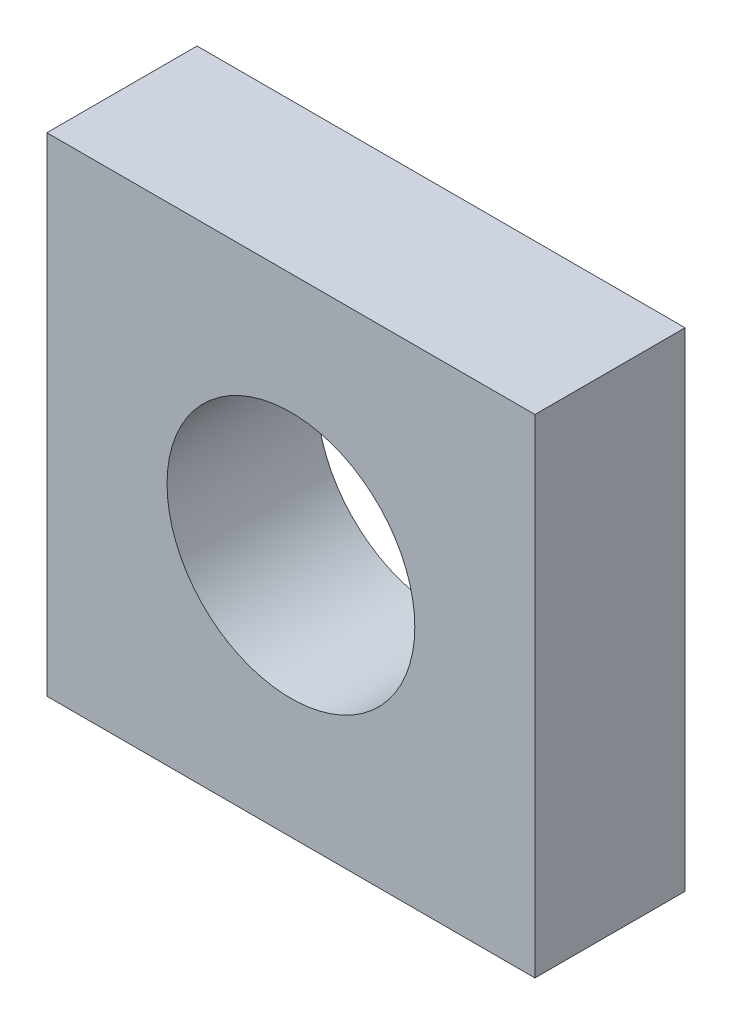
ISO-10303-21;
HEADER;
FILE_DESCRIPTION(('STEP AP214'),'2;1');
FILE_NAME('part.step','',(''),(''),'','','');
FILE_SCHEMA(('AUTOMOTIVE_DESIGN { 1 0 10303 214 1 1 1 1 }'));
ENDSEC;
DATA;
#1=APPLICATION_CONTEXT('core data for automotive mechanical design processes');
#2=APPLICATION_PROTOCOL_DEFINITION('international standard','automotive_design',2000,#1);
#3=PRODUCT_CONTEXT('',#1,'mechanical');
#4=PRODUCT('Part','Part','',(#3));
#5=PRODUCT_RELATED_PRODUCT_CATEGORY('part','',(#4));
#6=PRODUCT_DEFINITION_FORMATION('','',#4);
#7=PRODUCT_DEFINITION_CONTEXT('part definition',#1,'design');
#8=PRODUCT_DEFINITION('design','',#6,#7);
#9=PRODUCT_DEFINITION_SHAPE('','',#8);
#10=(LENGTH_UNIT() NAMED_UNIT(*) SI_UNIT(.MILLI.,.METRE.));
#11=(NAMED_UNIT(*) PLANE_ANGLE_UNIT() SI_UNIT($,.RADIAN.));
#12=(NAMED_UNIT(*) SI_UNIT($,.STERADIAN.) SOLID_ANGLE_UNIT());
#13=UNCERTAINTY_MEASURE_WITH_UNIT(LENGTH_MEASURE(1.E-05),#10,'distance_accuracy_value','');
#14=(GEOMETRIC_REPRESENTATION_CONTEXT(3) GLOBAL_UNCERTAINTY_ASSIGNED_CONTEXT((#13)) GLOBAL_UNIT_ASSIGNED_CONTEXT((#10,
#11,#12)) REPRESENTATION_CONTEXT('',''));
#15=CARTESIAN_POINT('',(0.,0.,0.));
#16=DIRECTION('',(0.,0.,1.));
#17=DIRECTION('',(1.,0.,0.));
#18=AXIS2_PLACEMENT_3D('',#15,#16,#17);
#19=CARTESIAN_POINT('',(0.,6.5,2.));
#20=DIRECTION('',(1.,0.,0.));
#21=DIRECTION('',(0.,1.,0.));
#22=AXIS2_PLACEMENT_3D('',#19,#20,#21);
#23=PLANE('',#22);
#24=DIRECTION('',(0.,-1.,0.));
#25=VECTOR('',#24,1.);
#26=CARTESIAN_POINT('',(0.,3.25,0.));
#27=LINE('',#26,#25);
#28=CARTESIAN_POINT('',(0.,6.5,0.));
#29=VERTEX_POINT('',#28);
#30=CARTESIAN_POINT('',(0.,0.,0.));
#31=VERTEX_POINT('',#30);
#32=EDGE_CURVE('E11',#29,#31,#27,.T.);
#33=ORIENTED_EDGE('',*,*,#32,.T.);
#34=DIRECTION('',(0.,0.,-1.));
#35=VECTOR('',#34,1.);
#36=CARTESIAN_POINT('',(0.,0.,1.));
#37=LINE('',#36,#35);
#38=CARTESIAN_POINT('',(0.,0.,2.));
#39=VERTEX_POINT('',#38);
#40=EDGE_CURVE('E57',#39,#31,#37,.T.);
#41=ORIENTED_EDGE('',*,*,#40,.F.);
#42=DIRECTION('',(0.,-1.,0.));
#43=VECTOR('',#42,1.);
#44=CARTESIAN_POINT('',(0.,3.25,2.));
#45=LINE('',#44,#43);
#46=CARTESIAN_POINT('',(0.,6.5,2.));
#47=VERTEX_POINT('',#46);
#48=EDGE_CURVE('E75',#47,#39,#45,.T.);
#49=ORIENTED_EDGE('',*,*,#48,.F.);
#50=DIRECTION('',(0.,0.,-1.));
#51=VECTOR('',#50,1.);
#52=CARTESIAN_POINT('',(0.,6.5,1.));
#53=LINE('',#52,#51);
#54=EDGE_CURVE('E43',#47,#29,#53,.T.);
#55=ORIENTED_EDGE('',*,*,#54,.T.);
#56=EDGE_LOOP('',(#33,#41,#49,#55));
#57=FACE_BOUND('',#56,.T.);
#58=ADVANCED_FACE('F40',(#57),#23,.F.);
#59=CARTESIAN_POINT('',(0.,0.,0.));
#60=DIRECTION('',(0.,0.,1.));
#61=DIRECTION('',(1.,0.,0.));
#62=AXIS2_PLACEMENT_3D('',#59,#60,#61);
#63=PLANE('',#62);
#64=CARTESIAN_POINT('',(3.25,3.25,0.));
#65=DIRECTION('',(0.,0.,1.));
#66=DIRECTION('',(1.,0.,0.));
#67=AXIS2_PLACEMENT_3D('',#64,#65,#66);
#68=CIRCLE('',#67,1.65);
#69=CARTESIAN_POINT('',(4.9,3.25,0.));
#70=VERTEX_POINT('',#69);
#71=EDGE_CURVE('E111',#70,#70,#68,.T.);
#72=ORIENTED_EDGE('',*,*,#71,.T.);
#73=EDGE_LOOP('',(#72));
#74=FACE_BOUND('',#73,.T.);
#75=ORIENTED_EDGE('',*,*,#32,.F.);
#76=DIRECTION('',(-1.,0.,0.));
#77=VECTOR('',#76,1.);
#78=CARTESIAN_POINT('',(3.25,6.5,0.));
#79=LINE('',#78,#77);
#80=CARTESIAN_POINT('',(6.5,6.5,0.));
#81=VERTEX_POINT('',#80);
#82=EDGE_CURVE('E86',#81,#29,#79,.T.);
#83=ORIENTED_EDGE('',*,*,#82,.F.);
#84=DIRECTION('',(0.,1.,0.));
#85=VECTOR('',#84,1.);
#86=CARTESIAN_POINT('',(6.5,3.25,0.));
#87=LINE('',#86,#85);
#88=CARTESIAN_POINT('',(6.5,0.,0.));
#89=VERTEX_POINT('',#88);
#90=EDGE_CURVE('E95',#89,#81,#87,.T.);
#91=ORIENTED_EDGE('',*,*,#90,.F.);
#92=DIRECTION('',(1.,0.,0.));
#93=VECTOR('',#92,1.);
#94=CARTESIAN_POINT('',(3.25,0.,0.));
#95=LINE('',#94,#93);
#96=EDGE_CURVE('E82',#31,#89,#95,.T.);
#97=ORIENTED_EDGE('',*,*,#96,.F.);
#98=EDGE_LOOP('',(#75,#83,#91,#97));
#99=FACE_BOUND('',#98,.T.);
#100=ADVANCED_FACE('F85',(#74,#99),#63,.F.);
#101=CARTESIAN_POINT('',(0.,0.,2.));
#102=DIRECTION('',(0.,1.,0.));
#103=DIRECTION('',(1.,0.,0.));
#104=AXIS2_PLACEMENT_3D('',#101,#102,#103);
#105=PLANE('',#104);
#106=ORIENTED_EDGE('',*,*,#96,.T.);
#107=DIRECTION('',(0.,0.,-1.));
#108=VECTOR('',#107,1.);
#109=CARTESIAN_POINT('',(6.5,0.,1.));
#110=LINE('',#109,#108);
#111=CARTESIAN_POINT('',(6.5,0.,2.));
#112=VERTEX_POINT('',#111);
#113=EDGE_CURVE('E108',#112,#89,#110,.T.);
#114=ORIENTED_EDGE('',*,*,#113,.F.);
#115=DIRECTION('',(1.,0.,0.));
#116=VECTOR('',#115,1.);
#117=CARTESIAN_POINT('',(3.25,0.,2.));
#118=LINE('',#117,#116);
#119=EDGE_CURVE('E101',#39,#112,#118,.T.);
#120=ORIENTED_EDGE('',*,*,#119,.F.);
#121=ORIENTED_EDGE('',*,*,#40,.T.);
#122=EDGE_LOOP('',(#106,#114,#120,#121));
#123=FACE_BOUND('',#122,.T.);
#124=ADVANCED_FACE('F122',(#123),#105,.F.);
#125=CARTESIAN_POINT('',(0.,0.,2.));
#126=DIRECTION('',(0.,0.,1.));
#127=DIRECTION('',(1.,0.,0.));
#128=AXIS2_PLACEMENT_3D('',#125,#126,#127);
#129=PLANE('',#128);
#130=CARTESIAN_POINT('',(3.25,3.25,2.));
#131=DIRECTION('',(0.,0.,1.));
#132=DIRECTION('',(1.,0.,0.));
#133=AXIS2_PLACEMENT_3D('',#130,#131,#132);
#134=CIRCLE('',#133,1.65);
#135=CARTESIAN_POINT('',(4.9,3.25,2.));
#136=VERTEX_POINT('',#135);
#137=EDGE_CURVE('E114',#136,#136,#134,.T.);
#138=ORIENTED_EDGE('',*,*,#137,.F.);
#139=EDGE_LOOP('',(#138));
#140=FACE_BOUND('',#139,.T.);
#141=ORIENTED_EDGE('',*,*,#48,.T.);
#142=ORIENTED_EDGE('',*,*,#119,.T.);
#143=DIRECTION('',(0.,1.,0.));
#144=VECTOR('',#143,1.);
#145=CARTESIAN_POINT('',(6.5,3.25,2.));
#146=LINE('',#145,#144);
#147=CARTESIAN_POINT('',(6.5,6.5,2.));
#148=VERTEX_POINT('',#147);
#149=EDGE_CURVE('E93',#112,#148,#146,.T.);
#150=ORIENTED_EDGE('',*,*,#149,.T.);
#151=DIRECTION('',(-1.,0.,0.));
#152=VECTOR('',#151,1.);
#153=CARTESIAN_POINT('',(3.25,6.5,2.));
#154=LINE('',#153,#152);
#155=EDGE_CURVE('E91',#148,#47,#154,.T.);
#156=ORIENTED_EDGE('',*,*,#155,.T.);
#157=EDGE_LOOP('',(#141,#142,#150,#156));
#158=FACE_BOUND('',#157,.T.);
#159=ADVANCED_FACE('F120',(#140,#158),#129,.T.);
#160=CARTESIAN_POINT('',(6.5,6.5,2.));
#161=DIRECTION('',(0.,-1.,0.));
#162=DIRECTION('',(0.,0.,-1.));
#163=AXIS2_PLACEMENT_3D('',#160,#161,#162);
#164=PLANE('',#163);
#165=ORIENTED_EDGE('',*,*,#82,.T.);
#166=ORIENTED_EDGE('',*,*,#54,.F.);
#167=ORIENTED_EDGE('',*,*,#155,.F.);
#168=DIRECTION('',(0.,0.,-1.));
#169=VECTOR('',#168,1.);
#170=CARTESIAN_POINT('',(6.5,6.5,1.));
#171=LINE('',#170,#169);
#172=EDGE_CURVE('E90',#148,#81,#171,.T.);
#173=ORIENTED_EDGE('',*,*,#172,.T.);
#174=EDGE_LOOP('',(#165,#166,#167,#173));
#175=FACE_BOUND('',#174,.T.);
#176=ADVANCED_FACE('F88',(#175),#164,.F.);
#177=CARTESIAN_POINT('',(6.5,0.,2.));
#178=DIRECTION('',(-1.,0.,0.));
#179=DIRECTION('',(0.,0.,1.));
#180=AXIS2_PLACEMENT_3D('',#177,#178,#179);
#181=PLANE('',#180);
#182=ORIENTED_EDGE('',*,*,#90,.T.);
#183=ORIENTED_EDGE('',*,*,#172,.F.);
#184=ORIENTED_EDGE('',*,*,#149,.F.);
#185=ORIENTED_EDGE('',*,*,#113,.T.);
#186=EDGE_LOOP('',(#182,#183,#184,#185));
#187=FACE_BOUND('',#186,.T.);
#188=ADVANCED_FACE('F128',(#187),#181,.F.);
#189=CARTESIAN_POINT('',(3.25,3.25,2.));
#190=DIRECTION('',(0.,0.,1.));
#191=DIRECTION('',(1.,0.,0.));
#192=AXIS2_PLACEMENT_3D('',#189,#190,#191);
#193=CYLINDRICAL_SURFACE('',#192,1.65);
#194=ORIENTED_EDGE('',*,*,#71,.F.);
#195=EDGE_LOOP('',(#194));
#196=FACE_BOUND('',#195,.T.);
#197=ORIENTED_EDGE('',*,*,#137,.T.);
#198=EDGE_LOOP('',(#197));
#199=FACE_BOUND('',#198,.T.);
#200=ADVANCED_FACE('F118',(#196,#199),#193,.F.);
#201=CLOSED_SHELL('',(#58,#100,#124,#159,#176,#188,#200));
#202=MANIFOLD_SOLID_BREP('B2',#201);
#203=ADVANCED_BREP_SHAPE_REPRESENTATION('',(#18,#202),#14);
#204=SHAPE_DEFINITION_REPRESENTATION(#9,#203);
ENDSEC;
END-ISO-10303-21;
